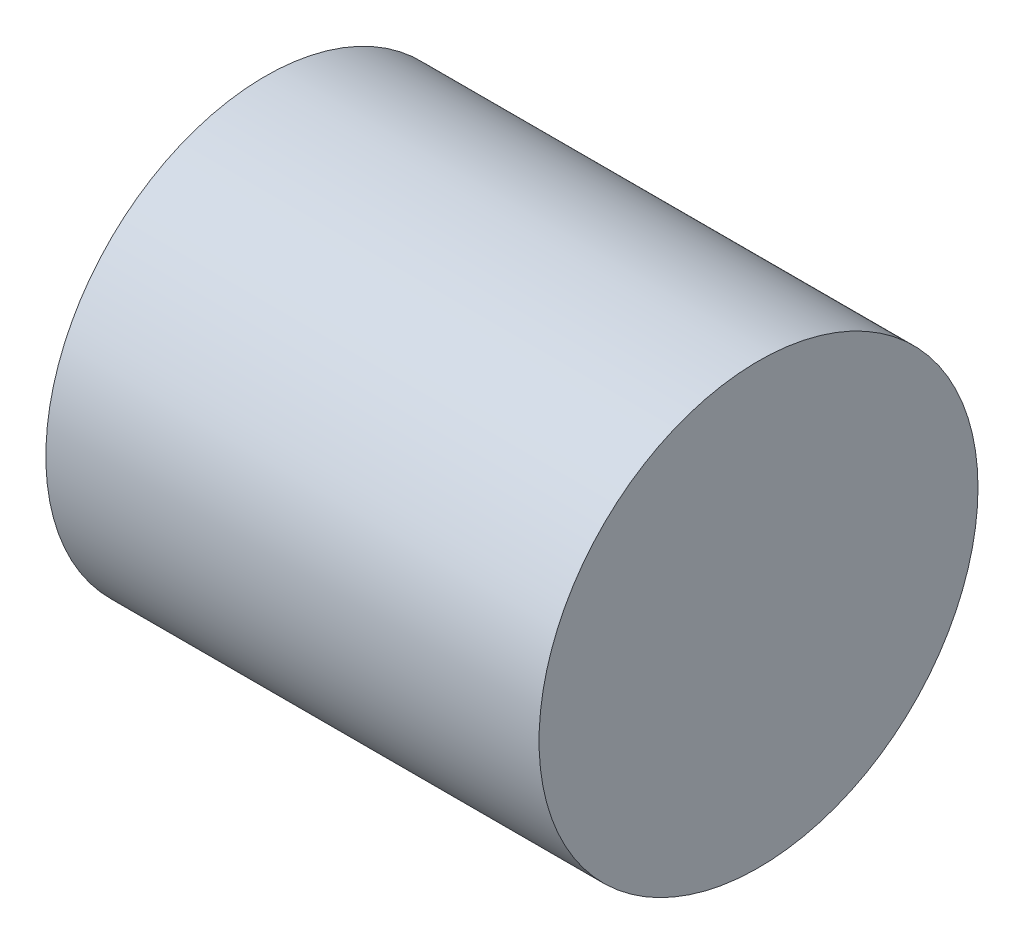
ISO-10303-21;
HEADER;
FILE_DESCRIPTION(('STEP AP214'),'2;1');
FILE_NAME('part.step','',(''),(''),'','','');
FILE_SCHEMA(('AUTOMOTIVE_DESIGN { 1 0 10303 214 1 1 1 1 }'));
ENDSEC;
DATA;
#1=APPLICATION_CONTEXT('core data for automotive mechanical design processes');
#2=APPLICATION_PROTOCOL_DEFINITION('international standard','automotive_design',2000,#1);
#3=PRODUCT_CONTEXT('',#1,'mechanical');
#4=PRODUCT('Part','Part','',(#3));
#5=PRODUCT_RELATED_PRODUCT_CATEGORY('part','',(#4));
#6=PRODUCT_DEFINITION_FORMATION('','',#4);
#7=PRODUCT_DEFINITION_CONTEXT('part definition',#1,'design');
#8=PRODUCT_DEFINITION('design','',#6,#7);
#9=PRODUCT_DEFINITION_SHAPE('','',#8);
#10=(LENGTH_UNIT() NAMED_UNIT(*) SI_UNIT(.MILLI.,.METRE.));
#11=(NAMED_UNIT(*) PLANE_ANGLE_UNIT() SI_UNIT($,.RADIAN.));
#12=(NAMED_UNIT(*) SI_UNIT($,.STERADIAN.) SOLID_ANGLE_UNIT());
#13=UNCERTAINTY_MEASURE_WITH_UNIT(LENGTH_MEASURE(1.E-05),#10,'distance_accuracy_value','');
#14=(GEOMETRIC_REPRESENTATION_CONTEXT(3) GLOBAL_UNCERTAINTY_ASSIGNED_CONTEXT((#13)) GLOBAL_UNIT_ASSIGNED_CONTEXT((#10,
#11,#12)) REPRESENTATION_CONTEXT('',''));
#15=CARTESIAN_POINT('',(0.,0.,0.));
#16=DIRECTION('',(0.,0.,1.));
#17=DIRECTION('',(1.,0.,0.));
#18=AXIS2_PLACEMENT_3D('',#15,#16,#17);
#19=CARTESIAN_POINT('',(0.,0.,0.));
#20=DIRECTION('',(1.,0.,0.));
#21=DIRECTION('',(0.,0.,-1.));
#22=AXIS2_PLACEMENT_3D('',#19,#20,#21);
#23=PLANE('',#22);
#24=CARTESIAN_POINT('',(0.,0.,0.));
#25=DIRECTION('',(1.,0.,0.));
#26=DIRECTION('',(0.,0.,-1.));
#27=AXIS2_PLACEMENT_3D('',#24,#25,#26);
#28=CIRCLE('',#27,2.225);
#29=CARTESIAN_POINT('',(0.,0.,-2.225));
#30=VERTEX_POINT('',#29);
#31=EDGE_CURVE('E17',#30,#30,#28,.T.);
#32=ORIENTED_EDGE('',*,*,#31,.F.);
#33=EDGE_LOOP('',(#32));
#34=FACE_BOUND('',#33,.T.);
#35=ADVANCED_FACE('F14',(#34),#23,.F.);
#36=CARTESIAN_POINT('',(5.,0.,0.));
#37=DIRECTION('',(1.,0.,0.));
#38=DIRECTION('',(0.,0.,-1.));
#39=AXIS2_PLACEMENT_3D('',#36,#37,#38);
#40=PLANE('',#39);
#41=CARTESIAN_POINT('',(5.,0.,0.));
#42=DIRECTION('',(1.,0.,0.));
#43=DIRECTION('',(0.,0.,-1.));
#44=AXIS2_PLACEMENT_3D('',#41,#42,#43);
#45=CIRCLE('',#44,2.225);
#46=CARTESIAN_POINT('',(5.,0.,-2.225));
#47=VERTEX_POINT('',#46);
#48=EDGE_CURVE('E10',#47,#47,#45,.F.);
#49=ORIENTED_EDGE('',*,*,#48,.F.);
#50=EDGE_LOOP('',(#49));
#51=FACE_BOUND('',#50,.T.);
#52=ADVANCED_FACE('F29',(#51),#40,.T.);
#53=CARTESIAN_POINT('',(2.5,0.,0.));
#54=DIRECTION('',(1.,0.,0.));
#55=DIRECTION('',(0.,0.,-1.));
#56=AXIS2_PLACEMENT_3D('',#53,#54,#55);
#57=CYLINDRICAL_SURFACE('',#56,2.225);
#58=ORIENTED_EDGE('',*,*,#31,.T.);
#59=EDGE_LOOP('',(#58));
#60=FACE_BOUND('',#59,.T.);
#61=ORIENTED_EDGE('',*,*,#48,.T.);
#62=EDGE_LOOP('',(#61));
#63=FACE_BOUND('',#62,.T.);
#64=ADVANCED_FACE('F26',(#60,#63),#57,.T.);
#65=CLOSED_SHELL('',(#35,#52,#64));
#66=MANIFOLD_SOLID_BREP('B1',#65);
#67=ADVANCED_BREP_SHAPE_REPRESENTATION('',(#18,#66),#14);
#68=SHAPE_DEFINITION_REPRESENTATION(#9,#67);
ENDSEC;
END-ISO-10303-21;
